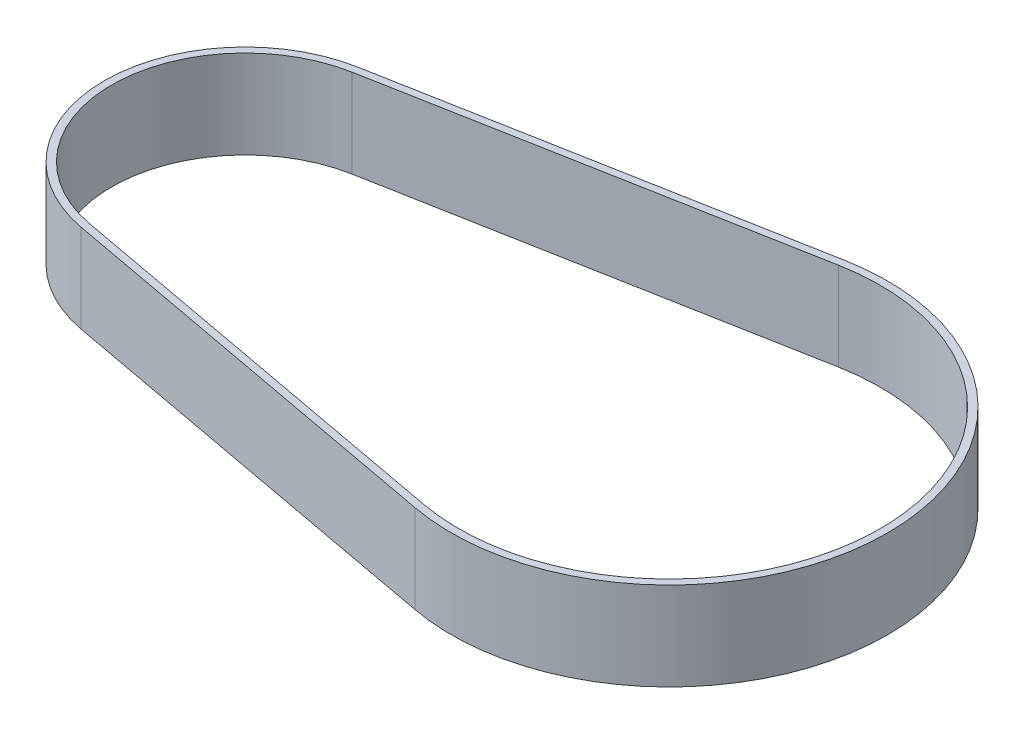
ISO-10303-21;
HEADER;
FILE_DESCRIPTION(('STEP AP214'),'2;1');
FILE_NAME('part.step','',(''),(''),'','','');
FILE_SCHEMA(('AUTOMOTIVE_DESIGN { 1 0 10303 214 1 1 1 1 }'));
ENDSEC;
DATA;
#1=APPLICATION_CONTEXT('core data for automotive mechanical design processes');
#2=APPLICATION_PROTOCOL_DEFINITION('international standard','automotive_design',2000,#1);
#3=PRODUCT_CONTEXT('',#1,'mechanical');
#4=PRODUCT('Part','Part','',(#3));
#5=PRODUCT_RELATED_PRODUCT_CATEGORY('part','',(#4));
#6=PRODUCT_DEFINITION_FORMATION('','',#4);
#7=PRODUCT_DEFINITION_CONTEXT('part definition',#1,'design');
#8=PRODUCT_DEFINITION('design','',#6,#7);
#9=PRODUCT_DEFINITION_SHAPE('','',#8);
#10=(LENGTH_UNIT() NAMED_UNIT(*) SI_UNIT(.MILLI.,.METRE.));
#11=(NAMED_UNIT(*) PLANE_ANGLE_UNIT() SI_UNIT($,.RADIAN.));
#12=(NAMED_UNIT(*) SI_UNIT($,.STERADIAN.) SOLID_ANGLE_UNIT());
#13=UNCERTAINTY_MEASURE_WITH_UNIT(LENGTH_MEASURE(1.E-05),#10,'distance_accuracy_value','');
#14=(GEOMETRIC_REPRESENTATION_CONTEXT(3) GLOBAL_UNCERTAINTY_ASSIGNED_CONTEXT((#13)) GLOBAL_UNIT_ASSIGNED_CONTEXT((#10,
#11,#12)) REPRESENTATION_CONTEXT('',''));
#15=CARTESIAN_POINT('',(0.,0.,0.));
#16=DIRECTION('',(0.,0.,1.));
#17=DIRECTION('',(1.,0.,0.));
#18=AXIS2_PLACEMENT_3D('',#15,#16,#17);
#19=CARTESIAN_POINT('',(0.,6.,0.));
#20=DIRECTION('',(0.,-1.,0.));
#21=DIRECTION('',(0.,0.,-1.));
#22=AXIS2_PLACEMENT_3D('',#19,#20,#21);
#23=PLANE('',#22);
#24=CARTESIAN_POINT('',(0.,6.,0.));
#25=DIRECTION('',(0.,-1.,0.));
#26=DIRECTION('',(-1.,0.,0.));
#27=AXIS2_PLACEMENT_3D('',#24,#25,#26);
#28=CIRCLE('',#27,9.57);
#29=CARTESIAN_POINT('',(-1.74429055403325,6.,-9.40969449361191));
#30=VERTEX_POINT('',#29);
#31=CARTESIAN_POINT('',(-1.74429055403325,6.,9.40969449361191));
#32=VERTEX_POINT('',#31);
#33=EDGE_CURVE('E168',#30,#32,#28,.F.);
#34=ORIENTED_EDGE('',*,*,#33,.T.);
#35=DIRECTION('',(0.983249163386825,0.,0.182266515572963));
#36=VECTOR('',#35,1.);
#37=CARTESIAN_POINT('',(-1.74429055403325,6.,9.40969449361191));
#38=LINE('',#37,#36);
#39=CARTESIAN_POINT('',(26.1293053966308,6.,14.5766688472097));
#40=VERTEX_POINT('',#39);
#41=EDGE_CURVE('E171',#32,#40,#38,.T.);
#42=ORIENTED_EDGE('',*,*,#41,.T.);
#43=CARTESIAN_POINT('',(28.83140649,6.,0.));
#44=DIRECTION('',(0.,-1.,0.));
#45=DIRECTION('',(-1.,0.,0.));
#46=AXIS2_PLACEMENT_3D('',#43,#44,#45);
#47=CIRCLE('',#46,14.825);
#48=CARTESIAN_POINT('',(26.1293053966308,6.,-14.5766688472097));
#49=VERTEX_POINT('',#48);
#50=EDGE_CURVE('E174',#40,#49,#47,.F.);
#51=ORIENTED_EDGE('',*,*,#50,.T.);
#52=DIRECTION('',(-0.983249163386825,0.,0.182266515572963));
#53=VECTOR('',#52,1.);
#54=CARTESIAN_POINT('',(-1.74429055403325,6.,-9.40969449361191));
#55=LINE('',#54,#53);
#56=EDGE_CURVE('E176',#49,#30,#55,.T.);
#57=ORIENTED_EDGE('',*,*,#56,.T.);
#58=EDGE_LOOP('',(#34,#42,#51,#57));
#59=FACE_BOUND('',#58,.T.);
#60=CARTESIAN_POINT('',(0.,6.,0.));
#61=DIRECTION('',(0.,1.,0.));
#62=DIRECTION('',(0.,0.,-1.));
#63=AXIS2_PLACEMENT_3D('',#60,#61,#62);
#64=CIRCLE('',#63,9.07);
#65=CARTESIAN_POINT('',(-1.65315729624677,6.,-8.9180699119185));
#66=VERTEX_POINT('',#65);
#67=CARTESIAN_POINT('',(-1.65315729624677,6.,8.9180699119185));
#68=VERTEX_POINT('',#67);
#69=EDGE_CURVE('E132',#66,#68,#64,.T.);
#70=ORIENTED_EDGE('',*,*,#69,.F.);
#71=DIRECTION('',(-0.983249163386825,0.,0.182266515572963));
#72=VECTOR('',#71,1.);
#73=CARTESIAN_POINT('',(-1.65315729624677,6.,-8.9180699119185));
#74=LINE('',#73,#72);
#75=CARTESIAN_POINT('',(26.2204386544173,6.,-14.0850442655163));
#76=VERTEX_POINT('',#75);
#77=EDGE_CURVE('E154',#76,#66,#74,.T.);
#78=ORIENTED_EDGE('',*,*,#77,.F.);
#79=CARTESIAN_POINT('',(28.83140649,6.,0.));
#80=DIRECTION('',(0.,1.,0.));
#81=DIRECTION('',(0.,0.,-1.));
#82=AXIS2_PLACEMENT_3D('',#79,#80,#81);
#83=CIRCLE('',#82,14.325);
#84=CARTESIAN_POINT('',(26.2204386544173,6.,14.0850442655163));
#85=VERTEX_POINT('',#84);
#86=EDGE_CURVE('E152',#85,#76,#83,.T.);
#87=ORIENTED_EDGE('',*,*,#86,.F.);
#88=DIRECTION('',(0.983249163386825,0.,0.182266515572963));
#89=VECTOR('',#88,1.);
#90=CARTESIAN_POINT('',(-1.65315729624677,6.,8.9180699119185));
#91=LINE('',#90,#89);
#92=EDGE_CURVE('E140',#68,#85,#91,.T.);
#93=ORIENTED_EDGE('',*,*,#92,.F.);
#94=EDGE_LOOP('',(#70,#78,#87,#93));
#95=FACE_BOUND('',#94,.T.);
#96=ADVANCED_FACE('F67',(#59,#95),#23,.F.);
#97=CARTESIAN_POINT('',(0.,0.,0.));
#98=DIRECTION('',(0.,-1.,0.));
#99=DIRECTION('',(0.,0.,-1.));
#100=AXIS2_PLACEMENT_3D('',#97,#98,#99);
#101=PLANE('',#100);
#102=CARTESIAN_POINT('',(0.,0.,0.));
#103=DIRECTION('',(0.,-1.,0.));
#104=DIRECTION('',(-1.,0.,0.));
#105=AXIS2_PLACEMENT_3D('',#102,#103,#104);
#106=CIRCLE('',#105,9.57);
#107=CARTESIAN_POINT('',(-1.74429055403325,0.,-9.40969449361191));
#108=VERTEX_POINT('',#107);
#109=CARTESIAN_POINT('',(-1.74429055403325,0.,9.40969449361191));
#110=VERTEX_POINT('',#109);
#111=EDGE_CURVE('E148',#108,#110,#106,.F.);
#112=ORIENTED_EDGE('',*,*,#111,.F.);
#113=DIRECTION('',(-0.983249163386825,0.,0.182266515572963));
#114=VECTOR('',#113,1.);
#115=CARTESIAN_POINT('',(-1.74429055403325,0.,-9.40969449361191));
#116=LINE('',#115,#114);
#117=CARTESIAN_POINT('',(26.1293053966308,0.,-14.5766688472097));
#118=VERTEX_POINT('',#117);
#119=EDGE_CURVE('E172',#118,#108,#116,.T.);
#120=ORIENTED_EDGE('',*,*,#119,.F.);
#121=CARTESIAN_POINT('',(28.83140649,0.,0.));
#122=DIRECTION('',(0.,-1.,0.));
#123=DIRECTION('',(-1.,0.,0.));
#124=AXIS2_PLACEMENT_3D('',#121,#122,#123);
#125=CIRCLE('',#124,14.825);
#126=CARTESIAN_POINT('',(26.1293053966308,0.,14.5766688472097));
#127=VERTEX_POINT('',#126);
#128=EDGE_CURVE('E183',#127,#118,#125,.F.);
#129=ORIENTED_EDGE('',*,*,#128,.F.);
#130=DIRECTION('',(0.983249163386825,0.,0.182266515572963));
#131=VECTOR('',#130,1.);
#132=CARTESIAN_POINT('',(-1.74429055403325,0.,9.40969449361191));
#133=LINE('',#132,#131);
#134=EDGE_CURVE('E181',#110,#127,#133,.T.);
#135=ORIENTED_EDGE('',*,*,#134,.F.);
#136=EDGE_LOOP('',(#112,#120,#129,#135));
#137=FACE_BOUND('',#136,.T.);
#138=DIRECTION('',(-0.983249163386825,0.,0.182266515572963));
#139=VECTOR('',#138,1.);
#140=CARTESIAN_POINT('',(-1.65315729624677,0.,-8.9180699119185));
#141=LINE('',#140,#139);
#142=CARTESIAN_POINT('',(26.2204386544173,0.,-14.0850442655163));
#143=VERTEX_POINT('',#142);
#144=CARTESIAN_POINT('',(-1.65315729624677,0.,-8.9180699119185));
#145=VERTEX_POINT('',#144);
#146=EDGE_CURVE('E141',#143,#145,#141,.T.);
#147=ORIENTED_EDGE('',*,*,#146,.T.);
#148=CARTESIAN_POINT('',(0.,0.,0.));
#149=DIRECTION('',(0.,1.,0.));
#150=DIRECTION('',(0.,0.,-1.));
#151=AXIS2_PLACEMENT_3D('',#148,#149,#150);
#152=CIRCLE('',#151,9.07);
#153=CARTESIAN_POINT('',(-1.65315729624677,0.,8.9180699119185));
#154=VERTEX_POINT('',#153);
#155=EDGE_CURVE('E90',#145,#154,#152,.T.);
#156=ORIENTED_EDGE('',*,*,#155,.T.);
#157=DIRECTION('',(0.983249163386825,0.,0.182266515572963));
#158=VECTOR('',#157,1.);
#159=CARTESIAN_POINT('',(-1.65315729624677,0.,8.9180699119185));
#160=LINE('',#159,#158);
#161=CARTESIAN_POINT('',(26.2204386544173,0.,14.0850442655163));
#162=VERTEX_POINT('',#161);
#163=EDGE_CURVE('E147',#154,#162,#160,.T.);
#164=ORIENTED_EDGE('',*,*,#163,.T.);
#165=CARTESIAN_POINT('',(28.83140649,0.,0.));
#166=DIRECTION('',(0.,1.,0.));
#167=DIRECTION('',(0.,0.,-1.));
#168=AXIS2_PLACEMENT_3D('',#165,#166,#167);
#169=CIRCLE('',#168,14.325);
#170=EDGE_CURVE('E160',#162,#143,#169,.T.);
#171=ORIENTED_EDGE('',*,*,#170,.T.);
#172=EDGE_LOOP('',(#147,#156,#164,#171));
#173=FACE_BOUND('',#172,.T.);
#174=ADVANCED_FACE('F201',(#137,#173),#101,.T.);
#175=CARTESIAN_POINT('',(0.,6.,0.));
#176=DIRECTION('',(0.,-1.,0.));
#177=DIRECTION('',(0.,0.,-1.));
#178=AXIS2_PLACEMENT_3D('',#175,#176,#177);
#179=CYLINDRICAL_SURFACE('',#178,9.57);
#180=ORIENTED_EDGE('',*,*,#111,.T.);
#181=DIRECTION('',(0.,-1.,0.));
#182=VECTOR('',#181,1.);
#183=CARTESIAN_POINT('',(-1.74429055403325,6.,9.40969449361191));
#184=LINE('',#183,#182);
#185=EDGE_CURVE('E12',#32,#110,#184,.T.);
#186=ORIENTED_EDGE('',*,*,#185,.F.);
#187=ORIENTED_EDGE('',*,*,#33,.F.);
#188=DIRECTION('',(0.,-1.,0.));
#189=VECTOR('',#188,1.);
#190=CARTESIAN_POINT('',(-1.74429055403325,6.,-9.40969449361191));
#191=LINE('',#190,#189);
#192=EDGE_CURVE('E178',#30,#108,#191,.T.);
#193=ORIENTED_EDGE('',*,*,#192,.T.);
#194=EDGE_LOOP('',(#180,#186,#187,#193));
#195=FACE_BOUND('',#194,.T.);
#196=ADVANCED_FACE('F69',(#195),#179,.T.);
#197=CARTESIAN_POINT('',(-1.74429055403325,6.,9.40969449361191));
#198=DIRECTION('',(0.182266515572963,0.,-0.983249163386825));
#199=DIRECTION('',(-0.983249163386825,0.,-0.182266515572963));
#200=AXIS2_PLACEMENT_3D('',#197,#198,#199);
#201=PLANE('',#200);
#202=ORIENTED_EDGE('',*,*,#134,.T.);
#203=DIRECTION('',(0.,-1.,0.));
#204=VECTOR('',#203,1.);
#205=CARTESIAN_POINT('',(26.1293053966308,6.,14.5766688472097));
#206=LINE('',#205,#204);
#207=EDGE_CURVE('E75',#40,#127,#206,.T.);
#208=ORIENTED_EDGE('',*,*,#207,.F.);
#209=ORIENTED_EDGE('',*,*,#41,.F.);
#210=ORIENTED_EDGE('',*,*,#185,.T.);
#211=EDGE_LOOP('',(#202,#208,#209,#210));
#212=FACE_BOUND('',#211,.T.);
#213=ADVANCED_FACE('F211',(#212),#201,.F.);
#214=CARTESIAN_POINT('',(28.83140649,6.,0.));
#215=DIRECTION('',(0.,-1.,0.));
#216=DIRECTION('',(0.,0.,-1.));
#217=AXIS2_PLACEMENT_3D('',#214,#215,#216);
#218=CYLINDRICAL_SURFACE('',#217,14.825);
#219=ORIENTED_EDGE('',*,*,#128,.T.);
#220=DIRECTION('',(0.,-1.,0.));
#221=VECTOR('',#220,1.);
#222=CARTESIAN_POINT('',(26.1293053966308,6.,-14.5766688472097));
#223=LINE('',#222,#221);
#224=EDGE_CURVE('E188',#49,#118,#223,.T.);
#225=ORIENTED_EDGE('',*,*,#224,.F.);
#226=ORIENTED_EDGE('',*,*,#50,.F.);
#227=ORIENTED_EDGE('',*,*,#207,.T.);
#228=EDGE_LOOP('',(#219,#225,#226,#227));
#229=FACE_BOUND('',#228,.T.);
#230=ADVANCED_FACE('F195',(#229),#218,.T.);
#231=CARTESIAN_POINT('',(-1.74429055403325,6.,-9.40969449361191));
#232=DIRECTION('',(0.182266515572963,0.,0.983249163386825));
#233=DIRECTION('',(0.983249163386825,0.,-0.182266515572963));
#234=AXIS2_PLACEMENT_3D('',#231,#232,#233);
#235=PLANE('',#234);
#236=ORIENTED_EDGE('',*,*,#119,.T.);
#237=ORIENTED_EDGE('',*,*,#192,.F.);
#238=ORIENTED_EDGE('',*,*,#56,.F.);
#239=ORIENTED_EDGE('',*,*,#224,.T.);
#240=EDGE_LOOP('',(#236,#237,#238,#239));
#241=FACE_BOUND('',#240,.T.);
#242=ADVANCED_FACE('F205',(#241),#235,.F.);
#243=CARTESIAN_POINT('',(0.,6.,0.));
#244=DIRECTION('',(0.,-1.,0.));
#245=DIRECTION('',(0.,0.,-1.));
#246=AXIS2_PLACEMENT_3D('',#243,#244,#245);
#247=CYLINDRICAL_SURFACE('',#246,9.07);
#248=ORIENTED_EDGE('',*,*,#155,.F.);
#249=DIRECTION('',(0.,-1.,0.));
#250=VECTOR('',#249,1.);
#251=CARTESIAN_POINT('',(-1.65315729624677,6.,-8.9180699119185));
#252=LINE('',#251,#250);
#253=EDGE_CURVE('E136',#66,#145,#252,.T.);
#254=ORIENTED_EDGE('',*,*,#253,.F.);
#255=ORIENTED_EDGE('',*,*,#69,.T.);
#256=DIRECTION('',(0.,-1.,0.));
#257=VECTOR('',#256,1.);
#258=CARTESIAN_POINT('',(-1.65315729624677,6.,8.9180699119185));
#259=LINE('',#258,#257);
#260=EDGE_CURVE('E135',#68,#154,#259,.T.);
#261=ORIENTED_EDGE('',*,*,#260,.T.);
#262=EDGE_LOOP('',(#248,#254,#255,#261));
#263=FACE_BOUND('',#262,.T.);
#264=ADVANCED_FACE('F134',(#263),#247,.F.);
#265=CARTESIAN_POINT('',(-1.65315729624677,6.,8.9180699119185));
#266=DIRECTION('',(0.182266515572962,0.,-0.983249163386825));
#267=DIRECTION('',(-0.983249163386825,0.,-0.182266515572963));
#268=AXIS2_PLACEMENT_3D('',#265,#266,#267);
#269=PLANE('',#268);
#270=ORIENTED_EDGE('',*,*,#163,.F.);
#271=ORIENTED_EDGE('',*,*,#260,.F.);
#272=ORIENTED_EDGE('',*,*,#92,.T.);
#273=DIRECTION('',(0.,-1.,0.));
#274=VECTOR('',#273,1.);
#275=CARTESIAN_POINT('',(26.2204386544173,6.,14.0850442655163));
#276=LINE('',#275,#274);
#277=EDGE_CURVE('E149',#85,#162,#276,.T.);
#278=ORIENTED_EDGE('',*,*,#277,.T.);
#279=EDGE_LOOP('',(#270,#271,#272,#278));
#280=FACE_BOUND('',#279,.T.);
#281=ADVANCED_FACE('F144',(#280),#269,.T.);
#282=CARTESIAN_POINT('',(28.83140649,6.,0.));
#283=DIRECTION('',(0.,-1.,0.));
#284=DIRECTION('',(0.,0.,-1.));
#285=AXIS2_PLACEMENT_3D('',#282,#283,#284);
#286=CYLINDRICAL_SURFACE('',#285,14.325);
#287=ORIENTED_EDGE('',*,*,#170,.F.);
#288=ORIENTED_EDGE('',*,*,#277,.F.);
#289=ORIENTED_EDGE('',*,*,#86,.T.);
#290=DIRECTION('',(0.,-1.,0.));
#291=VECTOR('',#290,1.);
#292=CARTESIAN_POINT('',(26.2204386544173,6.,-14.0850442655163));
#293=LINE('',#292,#291);
#294=EDGE_CURVE('E82',#76,#143,#293,.T.);
#295=ORIENTED_EDGE('',*,*,#294,.T.);
#296=EDGE_LOOP('',(#287,#288,#289,#295));
#297=FACE_BOUND('',#296,.T.);
#298=ADVANCED_FACE('F234',(#297),#286,.F.);
#299=CARTESIAN_POINT('',(-1.65315729624677,6.,-8.9180699119185));
#300=DIRECTION('',(0.182266515572962,0.,0.983249163386825));
#301=DIRECTION('',(0.983249163386825,0.,-0.182266515572963));
#302=AXIS2_PLACEMENT_3D('',#299,#300,#301);
#303=PLANE('',#302);
#304=ORIENTED_EDGE('',*,*,#146,.F.);
#305=ORIENTED_EDGE('',*,*,#294,.F.);
#306=ORIENTED_EDGE('',*,*,#77,.T.);
#307=ORIENTED_EDGE('',*,*,#253,.T.);
#308=EDGE_LOOP('',(#304,#305,#306,#307));
#309=FACE_BOUND('',#308,.T.);
#310=ADVANCED_FACE('F238',(#309),#303,.T.);
#311=CLOSED_SHELL('',(#96,#174,#196,#213,#230,#242,#264,#281,#298,#310));
#312=MANIFOLD_SOLID_BREP('B2',#311);
#313=ADVANCED_BREP_SHAPE_REPRESENTATION('',(#18,#312),#14);
#314=SHAPE_DEFINITION_REPRESENTATION(#9,#313);
ENDSEC;
END-ISO-10303-21;
